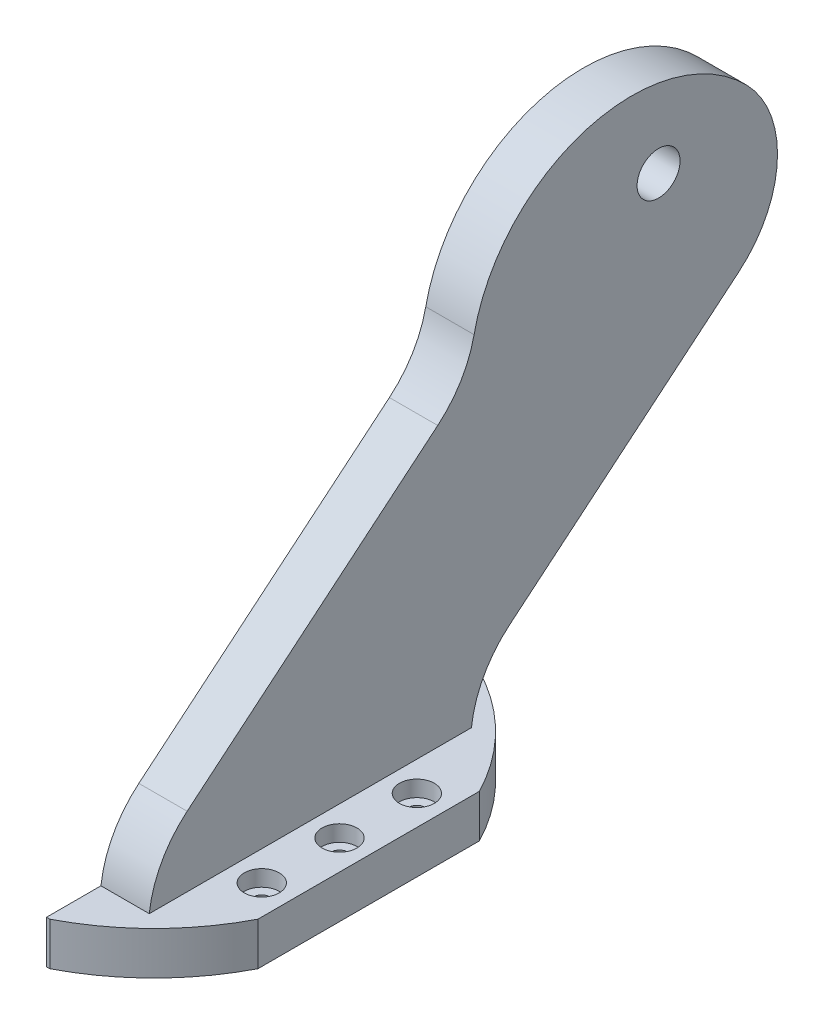
ISO-10303-21;
HEADER;
FILE_DESCRIPTION(('STEP AP214'),'2;1');
FILE_NAME('part.step','',(''),(''),'','','');
FILE_SCHEMA(('AUTOMOTIVE_DESIGN { 1 0 10303 214 1 1 1 1 }'));
ENDSEC;
DATA;
#1=APPLICATION_CONTEXT('core data for automotive mechanical design processes');
#2=APPLICATION_PROTOCOL_DEFINITION('international standard','automotive_design',2000,#1);
#3=PRODUCT_CONTEXT('',#1,'mechanical');
#4=PRODUCT('Part','Part','',(#3));
#5=PRODUCT_RELATED_PRODUCT_CATEGORY('part','',(#4));
#6=PRODUCT_DEFINITION_FORMATION('','',#4);
#7=PRODUCT_DEFINITION_CONTEXT('part definition',#1,'design');
#8=PRODUCT_DEFINITION('design','',#6,#7);
#9=PRODUCT_DEFINITION_SHAPE('','',#8);
#10=(LENGTH_UNIT() NAMED_UNIT(*) SI_UNIT(.MILLI.,.METRE.));
#11=(NAMED_UNIT(*) PLANE_ANGLE_UNIT() SI_UNIT($,.RADIAN.));
#12=(NAMED_UNIT(*) SI_UNIT($,.STERADIAN.) SOLID_ANGLE_UNIT());
#13=UNCERTAINTY_MEASURE_WITH_UNIT(LENGTH_MEASURE(1.E-05),#10,'distance_accuracy_value','');
#14=(GEOMETRIC_REPRESENTATION_CONTEXT(3) GLOBAL_UNCERTAINTY_ASSIGNED_CONTEXT((#13)) GLOBAL_UNIT_ASSIGNED_CONTEXT((#10,
#11,#12)) REPRESENTATION_CONTEXT('',''));
#15=CARTESIAN_POINT('',(0.,0.,0.));
#16=DIRECTION('',(0.,0.,1.));
#17=DIRECTION('',(1.,0.,0.));
#18=AXIS2_PLACEMENT_3D('',#15,#16,#17);
#19=CARTESIAN_POINT('',(14.5,-79.,14.4108650550875));
#20=DIRECTION('',(0.,1.,0.));
#21=DIRECTION('',(0.,0.,1.));
#22=AXIS2_PLACEMENT_3D('',#19,#20,#21);
#23=CYLINDRICAL_SURFACE('',#22,1.5);
#24=CARTESIAN_POINT('',(14.5,0.,14.4108650550875));
#25=DIRECTION('',(0.,-1.,0.));
#26=DIRECTION('',(0.,0.,-1.));
#27=AXIS2_PLACEMENT_3D('',#24,#25,#26);
#28=CIRCLE('',#27,1.5);
#29=CARTESIAN_POINT('',(14.5,0.,12.9108650550875));
#30=VERTEX_POINT('',#29);
#31=EDGE_CURVE('E211',#30,#30,#28,.T.);
#32=ORIENTED_EDGE('',*,*,#31,.T.);
#33=EDGE_LOOP('',(#32));
#34=FACE_BOUND('',#33,.T.);
#35=CARTESIAN_POINT('',(14.5,5.,14.4108650550875));
#36=DIRECTION('',(0.,1.,0.));
#37=DIRECTION('',(0.,0.,1.));
#38=AXIS2_PLACEMENT_3D('',#35,#36,#37);
#39=CIRCLE('',#38,1.5);
#40=CARTESIAN_POINT('',(14.5,5.,15.9108650550875));
#41=VERTEX_POINT('',#40);
#42=EDGE_CURVE('E40',#41,#41,#39,.F.);
#43=ORIENTED_EDGE('',*,*,#42,.F.);
#44=EDGE_LOOP('',(#43));
#45=FACE_BOUND('',#44,.T.);
#46=ADVANCED_FACE('F36',(#34,#45),#23,.F.);
#47=CARTESIAN_POINT('',(14.5,-79.,-0.0703103162123901));
#48=DIRECTION('',(0.,1.,0.));
#49=DIRECTION('',(0.,0.,1.));
#50=AXIS2_PLACEMENT_3D('',#47,#48,#49);
#51=CYLINDRICAL_SURFACE('',#50,1.5);
#52=CARTESIAN_POINT('',(14.5,0.,-0.0703103162123901));
#53=DIRECTION('',(0.,-1.,0.));
#54=DIRECTION('',(0.,0.,-1.));
#55=AXIS2_PLACEMENT_3D('',#52,#53,#54);
#56=CIRCLE('',#55,1.5);
#57=CARTESIAN_POINT('',(14.5,0.,-1.57031031621239));
#58=VERTEX_POINT('',#57);
#59=EDGE_CURVE('E214',#58,#58,#56,.T.);
#60=ORIENTED_EDGE('',*,*,#59,.T.);
#61=EDGE_LOOP('',(#60));
#62=FACE_BOUND('',#61,.T.);
#63=CARTESIAN_POINT('',(14.5,5.,-0.0703103162123901));
#64=DIRECTION('',(0.,1.,0.));
#65=DIRECTION('',(0.,0.,1.));
#66=AXIS2_PLACEMENT_3D('',#63,#64,#65);
#67=CIRCLE('',#66,1.5);
#68=CARTESIAN_POINT('',(14.5,5.,1.42968968378761));
#69=VERTEX_POINT('',#68);
#70=EDGE_CURVE('E221',#69,#69,#67,.F.);
#71=ORIENTED_EDGE('',*,*,#70,.F.);
#72=EDGE_LOOP('',(#71));
#73=FACE_BOUND('',#72,.T.);
#74=ADVANCED_FACE('F232',(#62,#73),#51,.F.);
#75=CARTESIAN_POINT('',(14.5,-79.,-14.4811753712999));
#76=DIRECTION('',(0.,1.,0.));
#77=DIRECTION('',(0.,0.,1.));
#78=AXIS2_PLACEMENT_3D('',#75,#76,#77);
#79=CYLINDRICAL_SURFACE('',#78,1.5);
#80=CARTESIAN_POINT('',(14.5,0.,-14.4811753712999));
#81=DIRECTION('',(0.,-1.,0.));
#82=DIRECTION('',(0.,0.,-1.));
#83=AXIS2_PLACEMENT_3D('',#80,#81,#82);
#84=CIRCLE('',#83,1.5);
#85=CARTESIAN_POINT('',(14.5,0.,-15.9811753712999));
#86=VERTEX_POINT('',#85);
#87=EDGE_CURVE('E147',#86,#86,#84,.T.);
#88=ORIENTED_EDGE('',*,*,#87,.T.);
#89=EDGE_LOOP('',(#88));
#90=FACE_BOUND('',#89,.T.);
#91=CARTESIAN_POINT('',(14.5,5.,-14.4811753712999));
#92=DIRECTION('',(0.,1.,0.));
#93=DIRECTION('',(0.,0.,1.));
#94=AXIS2_PLACEMENT_3D('',#91,#92,#93);
#95=CIRCLE('',#94,1.5);
#96=CARTESIAN_POINT('',(14.5,5.,-12.9811753712999));
#97=VERTEX_POINT('',#96);
#98=EDGE_CURVE('E219',#97,#97,#95,.F.);
#99=ORIENTED_EDGE('',*,*,#98,.F.);
#100=EDGE_LOOP('',(#99));
#101=FACE_BOUND('',#100,.T.);
#102=ADVANCED_FACE('F238',(#90,#101),#79,.F.);
#103=CARTESIAN_POINT('',(0.,8.,0.));
#104=DIRECTION('',(0.,-1.,0.));
#105=DIRECTION('',(0.,0.,-1.));
#106=AXIS2_PLACEMENT_3D('',#103,#104,#105);
#107=PLANE('',#106);
#108=CARTESIAN_POINT('',(14.5,8.,-14.4811753712999));
#109=DIRECTION('',(0.,1.,0.));
#110=DIRECTION('',(0.,0.,1.));
#111=AXIS2_PLACEMENT_3D('',#108,#109,#110);
#112=CIRCLE('',#111,3.25);
#113=CARTESIAN_POINT('',(14.5,8.,-11.2311753712999));
#114=VERTEX_POINT('',#113);
#115=EDGE_CURVE('E378',#114,#114,#112,.T.);
#116=ORIENTED_EDGE('',*,*,#115,.F.);
#117=EDGE_LOOP('',(#116));
#118=FACE_BOUND('',#117,.T.);
#119=CARTESIAN_POINT('',(14.5,8.,-0.0703103162123901));
#120=DIRECTION('',(0.,1.,0.));
#121=DIRECTION('',(0.,0.,1.));
#122=AXIS2_PLACEMENT_3D('',#119,#120,#121);
#123=CIRCLE('',#122,3.25);
#124=CARTESIAN_POINT('',(14.5,8.,3.17968968378761));
#125=VERTEX_POINT('',#124);
#126=EDGE_CURVE('E372',#125,#125,#123,.T.);
#127=ORIENTED_EDGE('',*,*,#126,.F.);
#128=EDGE_LOOP('',(#127));
#129=FACE_BOUND('',#128,.T.);
#130=CARTESIAN_POINT('',(14.5,8.,14.4108650550875));
#131=DIRECTION('',(0.,1.,0.));
#132=DIRECTION('',(0.,0.,1.));
#133=AXIS2_PLACEMENT_3D('',#130,#131,#132);
#134=CIRCLE('',#133,3.25);
#135=CARTESIAN_POINT('',(14.5,8.,17.6608650550875));
#136=VERTEX_POINT('',#135);
#137=EDGE_CURVE('E366',#136,#136,#134,.T.);
#138=ORIENTED_EDGE('',*,*,#137,.F.);
#139=EDGE_LOOP('',(#138));
#140=FACE_BOUND('',#139,.T.);
#141=DIRECTION('',(-1.,0.,0.));
#142=VECTOR('',#141,1.);
#143=CARTESIAN_POINT('',(13.,8.,-30.1406206324248));
#144=LINE('',#143,#142);
#145=CARTESIAN_POINT('',(9.00000000000001,8.00000000000001,-30.1406206324248));
#146=VERTEX_POINT('',#145);
#147=CARTESIAN_POINT('',(0.,8.,-30.1406206324248));
#148=VERTEX_POINT('',#147);
#149=EDGE_CURVE('E153',#146,#148,#144,.T.);
#150=ORIENTED_EDGE('',*,*,#149,.F.);
#151=DIRECTION('',(0.,0.,1.));
#152=VECTOR('',#151,1.);
#153=CARTESIAN_POINT('',(9.00000000000001,8.00000000000001,-87.1493241194241));
#154=LINE('',#153,#152);
#155=CARTESIAN_POINT('',(9.00000000000001,8.00000000000001,29.8593793675752));
#156=VERTEX_POINT('',#155);
#157=EDGE_CURVE('E137',#146,#156,#154,.T.);
#158=ORIENTED_EDGE('',*,*,#157,.T.);
#159=DIRECTION('',(-1.,0.,0.));
#160=VECTOR('',#159,1.);
#161=CARTESIAN_POINT('',(13.,8.,29.8593793675752));
#162=LINE('',#161,#160);
#163=CARTESIAN_POINT('',(0.,8.,29.8593793675752));
#164=VERTEX_POINT('',#163);
#165=EDGE_CURVE('E61',#164,#156,#162,.F.);
#166=ORIENTED_EDGE('',*,*,#165,.F.);
#167=DIRECTION('',(0.,0.,1.));
#168=VECTOR('',#167,1.);
#169=CARTESIAN_POINT('',(0.,8.,40.));
#170=LINE('',#169,#168);
#171=CARTESIAN_POINT('',(0.,8.,40.));
#172=VERTEX_POINT('',#171);
#173=EDGE_CURVE('E189',#164,#172,#170,.T.);
#174=ORIENTED_EDGE('',*,*,#173,.T.);
#175=DIRECTION('',(1.,0.,0.));
#176=VECTOR('',#175,1.);
#177=CARTESIAN_POINT('',(20.,8.,40.));
#178=LINE('',#177,#176);
#179=CARTESIAN_POINT('',(0.615528128088336,8.,40.));
#180=VERTEX_POINT('',#179);
#181=EDGE_CURVE('E188',#172,#180,#178,.T.);
#182=ORIENTED_EDGE('',*,*,#181,.T.);
#183=CARTESIAN_POINT('',(-20.,8.,0.));
#184=DIRECTION('',(0.,1.,0.));
#185=DIRECTION('',(0.,0.,1.));
#186=AXIS2_PLACEMENT_3D('',#183,#184,#185);
#187=CIRCLE('',#186,45.);
#188=CARTESIAN_POINT('',(20.,8.,20.6155281280883));
#189=VERTEX_POINT('',#188);
#190=EDGE_CURVE('E162',#180,#189,#187,.T.);
#191=ORIENTED_EDGE('',*,*,#190,.T.);
#192=DIRECTION('',(0.,0.,-1.));
#193=VECTOR('',#192,1.);
#194=CARTESIAN_POINT('',(20.,8.,-40.));
#195=LINE('',#194,#193);
#196=CARTESIAN_POINT('',(20.,8.,-20.6155281280883));
#197=VERTEX_POINT('',#196);
#198=EDGE_CURVE('E192',#189,#197,#195,.T.);
#199=ORIENTED_EDGE('',*,*,#198,.T.);
#200=CARTESIAN_POINT('',(-20.,8.,0.));
#201=DIRECTION('',(0.,1.,0.));
#202=DIRECTION('',(0.,0.,1.));
#203=AXIS2_PLACEMENT_3D('',#200,#201,#202);
#204=CIRCLE('',#203,45.);
#205=CARTESIAN_POINT('',(0.615528128088304,8.,-40.));
#206=VERTEX_POINT('',#205);
#207=EDGE_CURVE('E172',#197,#206,#204,.T.);
#208=ORIENTED_EDGE('',*,*,#207,.T.);
#209=DIRECTION('',(-1.,0.,0.));
#210=VECTOR('',#209,1.);
#211=CARTESIAN_POINT('',(0.,8.,-40.));
#212=LINE('',#211,#210);
#213=CARTESIAN_POINT('',(0.,8.,-40.));
#214=VERTEX_POINT('',#213);
#215=EDGE_CURVE('E195',#206,#214,#212,.T.);
#216=ORIENTED_EDGE('',*,*,#215,.T.);
#217=EDGE_CURVE('E160',#214,#148,#170,.T.);
#218=ORIENTED_EDGE('',*,*,#217,.T.);
#219=EDGE_LOOP('',(#150,#158,#166,#174,#182,#191,#199,#208,#216,#218));
#220=FACE_BOUND('',#219,.T.);
#221=ADVANCED_FACE('F158',(#118,#129,#140,#220),#107,.F.);
#222=CARTESIAN_POINT('',(20.,8.,40.));
#223=DIRECTION('',(0.,0.,-1.));
#224=DIRECTION('',(-1.,0.,0.));
#225=AXIS2_PLACEMENT_3D('',#222,#223,#224);
#226=PLANE('',#225);
#227=DIRECTION('',(0.,1.,0.));
#228=VECTOR('',#227,1.);
#229=CARTESIAN_POINT('',(0.615528128088336,0.,40.));
#230=LINE('',#229,#228);
#231=CARTESIAN_POINT('',(0.615528128088336,0.,40.));
#232=VERTEX_POINT('',#231);
#233=EDGE_CURVE('E181',#232,#180,#230,.T.);
#234=ORIENTED_EDGE('',*,*,#233,.T.);
#235=ORIENTED_EDGE('',*,*,#181,.F.);
#236=DIRECTION('',(0.,-1.,0.));
#237=VECTOR('',#236,1.);
#238=CARTESIAN_POINT('',(0.,8.,40.));
#239=LINE('',#238,#237);
#240=CARTESIAN_POINT('',(0.,0.,40.));
#241=VERTEX_POINT('',#240);
#242=EDGE_CURVE('E11',#172,#241,#239,.T.);
#243=ORIENTED_EDGE('',*,*,#242,.T.);
#244=DIRECTION('',(1.,0.,0.));
#245=VECTOR('',#244,1.);
#246=CARTESIAN_POINT('',(20.,0.,40.));
#247=LINE('',#246,#245);
#248=EDGE_CURVE('E178',#241,#232,#247,.T.);
#249=ORIENTED_EDGE('',*,*,#248,.T.);
#250=EDGE_LOOP('',(#234,#235,#243,#249));
#251=FACE_BOUND('',#250,.T.);
#252=ADVANCED_FACE('F38',(#251),#226,.F.);
#253=CARTESIAN_POINT('',(20.,8.,-40.));
#254=DIRECTION('',(-1.,0.,0.));
#255=DIRECTION('',(0.,0.,1.));
#256=AXIS2_PLACEMENT_3D('',#253,#254,#255);
#257=PLANE('',#256);
#258=DIRECTION('',(0.,1.,0.));
#259=VECTOR('',#258,1.);
#260=CARTESIAN_POINT('',(20.,0.,-20.6155281280883));
#261=LINE('',#260,#259);
#262=CARTESIAN_POINT('',(20.,0.,-20.6155281280883));
#263=VERTEX_POINT('',#262);
#264=EDGE_CURVE('E171',#263,#197,#261,.T.);
#265=ORIENTED_EDGE('',*,*,#264,.T.);
#266=ORIENTED_EDGE('',*,*,#198,.F.);
#267=DIRECTION('',(0.,1.,0.));
#268=VECTOR('',#267,1.);
#269=CARTESIAN_POINT('',(20.,0.,20.6155281280883));
#270=LINE('',#269,#268);
#271=CARTESIAN_POINT('',(20.,0.,20.6155281280883));
#272=VERTEX_POINT('',#271);
#273=EDGE_CURVE('E174',#272,#189,#270,.T.);
#274=ORIENTED_EDGE('',*,*,#273,.F.);
#275=DIRECTION('',(0.,0.,-1.));
#276=VECTOR('',#275,1.);
#277=CARTESIAN_POINT('',(20.,0.,-40.));
#278=LINE('',#277,#276);
#279=EDGE_CURVE('E199',#272,#263,#278,.T.);
#280=ORIENTED_EDGE('',*,*,#279,.T.);
#281=EDGE_LOOP('',(#265,#266,#274,#280));
#282=FACE_BOUND('',#281,.T.);
#283=ADVANCED_FACE('F298',(#282),#257,.F.);
#284=CARTESIAN_POINT('',(0.,8.,-40.));
#285=DIRECTION('',(0.,0.,1.));
#286=DIRECTION('',(1.,0.,0.));
#287=AXIS2_PLACEMENT_3D('',#284,#285,#286);
#288=PLANE('',#287);
#289=DIRECTION('',(0.,1.,0.));
#290=VECTOR('',#289,1.);
#291=CARTESIAN_POINT('',(0.615528128088304,0.,-40.));
#292=LINE('',#291,#290);
#293=CARTESIAN_POINT('',(0.615528128088304,0.,-40.));
#294=VERTEX_POINT('',#293);
#295=EDGE_CURVE('E175',#294,#206,#292,.T.);
#296=ORIENTED_EDGE('',*,*,#295,.F.);
#297=DIRECTION('',(-1.,0.,0.));
#298=VECTOR('',#297,1.);
#299=CARTESIAN_POINT('',(0.,0.,-40.));
#300=LINE('',#299,#298);
#301=CARTESIAN_POINT('',(0.,0.,-40.));
#302=VERTEX_POINT('',#301);
#303=EDGE_CURVE('E202',#294,#302,#300,.T.);
#304=ORIENTED_EDGE('',*,*,#303,.T.);
#305=DIRECTION('',(0.,-1.,0.));
#306=VECTOR('',#305,1.);
#307=CARTESIAN_POINT('',(0.,8.,-40.));
#308=LINE('',#307,#306);
#309=EDGE_CURVE('E45',#214,#302,#308,.T.);
#310=ORIENTED_EDGE('',*,*,#309,.F.);
#311=ORIENTED_EDGE('',*,*,#215,.F.);
#312=EDGE_LOOP('',(#296,#304,#310,#311));
#313=FACE_BOUND('',#312,.T.);
#314=ADVANCED_FACE('F292',(#313),#288,.F.);
#315=CARTESIAN_POINT('',(0.,0.,0.));
#316=DIRECTION('',(0.,-1.,0.));
#317=DIRECTION('',(0.,0.,-1.));
#318=AXIS2_PLACEMENT_3D('',#315,#316,#317);
#319=PLANE('',#318);
#320=ORIENTED_EDGE('',*,*,#87,.F.);
#321=EDGE_LOOP('',(#320));
#322=FACE_BOUND('',#321,.T.);
#323=ORIENTED_EDGE('',*,*,#59,.F.);
#324=EDGE_LOOP('',(#323));
#325=FACE_BOUND('',#324,.T.);
#326=ORIENTED_EDGE('',*,*,#31,.F.);
#327=EDGE_LOOP('',(#326));
#328=FACE_BOUND('',#327,.T.);
#329=ORIENTED_EDGE('',*,*,#248,.F.);
#330=DIRECTION('',(0.,0.,1.));
#331=VECTOR('',#330,1.);
#332=CARTESIAN_POINT('',(0.,0.,0.));
#333=LINE('',#332,#331);
#334=EDGE_CURVE('E204',#302,#241,#333,.T.);
#335=ORIENTED_EDGE('',*,*,#334,.F.);
#336=ORIENTED_EDGE('',*,*,#303,.F.);
#337=CARTESIAN_POINT('',(-20.,0.,0.));
#338=DIRECTION('',(0.,1.,0.));
#339=DIRECTION('',(0.,0.,1.));
#340=AXIS2_PLACEMENT_3D('',#337,#338,#339);
#341=CIRCLE('',#340,45.);
#342=EDGE_CURVE('E169',#263,#294,#341,.T.);
#343=ORIENTED_EDGE('',*,*,#342,.F.);
#344=ORIENTED_EDGE('',*,*,#279,.F.);
#345=CARTESIAN_POINT('',(-20.,0.,0.));
#346=DIRECTION('',(0.,1.,0.));
#347=DIRECTION('',(0.,0.,1.));
#348=AXIS2_PLACEMENT_3D('',#345,#346,#347);
#349=CIRCLE('',#348,45.);
#350=EDGE_CURVE('E164',#232,#272,#349,.T.);
#351=ORIENTED_EDGE('',*,*,#350,.F.);
#352=EDGE_LOOP('',(#329,#335,#336,#343,#344,#351));
#353=FACE_BOUND('',#352,.T.);
#354=ADVANCED_FACE('F289',(#322,#325,#328,#353),#319,.T.);
#355=CARTESIAN_POINT('',(0.,8.,0.));
#356=DIRECTION('',(1.,0.,0.));
#357=DIRECTION('',(0.,0.,-1.));
#358=AXIS2_PLACEMENT_3D('',#355,#356,#357);
#359=PLANE('',#358);
#360=ORIENTED_EDGE('',*,*,#334,.T.);
#361=ORIENTED_EDGE('',*,*,#242,.F.);
#362=ORIENTED_EDGE('',*,*,#173,.F.);
#363=CARTESIAN_POINT('',(0.,5.63250108031114,10.));
#364=DIRECTION('',(1.,0.,0.));
#365=DIRECTION('',(0.,0.,1.));
#366=AXIS2_PLACEMENT_3D('',#363,#364,#365);
#367=CIRCLE('',#366,20.);
#368=CARTESIAN_POINT('',(0.,20.9969266722587,22.8036879932895));
#369=VERTEX_POINT('',#368);
#370=EDGE_CURVE('E342',#369,#164,#367,.T.);
#371=ORIENTED_EDGE('',*,*,#370,.F.);
#372=DIRECTION('',(0.,-0.64018439966448,0.768221279597376));
#373=VECTOR('',#372,1.);
#374=CARTESIAN_POINT('',(0.,59.8885022104217,-23.8662026525061));
#375=LINE('',#374,#373);
#376=CARTESIAN_POINT('',(0.,59.8885022104217,-23.8662026525061));
#377=VERTEX_POINT('',#376);
#378=EDGE_CURVE('E339',#377,#369,#375,.T.);
#379=ORIENTED_EDGE('',*,*,#378,.F.);
#380=CARTESIAN_POINT('',(0.,75.2529278023692,-11.0625146592165));
#381=DIRECTION('',(-1.,0.,0.));
#382=DIRECTION('',(0.,0.,1.));
#383=AXIS2_PLACEMENT_3D('',#380,#381,#382);
#384=CIRCLE('',#383,20.);
#385=CARTESIAN_POINT('',(0.,71.1517566814215,-30.6375087955299));
#386=VERTEX_POINT('',#385);
#387=EDGE_CURVE('E336',#386,#377,#384,.T.);
#388=ORIENTED_EDGE('',*,*,#387,.F.);
#389=CARTESIAN_POINT('',(0.,65.,-60.));
#390=DIRECTION('',(1.,0.,0.));
#391=DIRECTION('',(0.,0.,-1.));
#392=AXIS2_PLACEMENT_3D('',#389,#390,#391);
#393=CIRCLE('',#392,30.);
#394=CARTESIAN_POINT('',(0.,85.9758070576268,-81.4479723582723));
#395=VERTEX_POINT('',#394);
#396=EDGE_CURVE('E333',#395,#386,#393,.T.);
#397=ORIENTED_EDGE('',*,*,#396,.F.);
#398=CARTESIAN_POINT('',(0.,71.9919356858756,-67.1493241194241));
#399=DIRECTION('',(1.,0.,0.));
#400=DIRECTION('',(0.,0.,1.));
#401=AXIS2_PLACEMENT_3D('',#398,#399,#400);
#402=CIRCLE('',#401,20.);
#403=CARTESIAN_POINT('',(0.,56.6275100939281,-79.9530121127137));
#404=VERTEX_POINT('',#403);
#405=EDGE_CURVE('E326',#404,#395,#402,.T.);
#406=ORIENTED_EDGE('',*,*,#405,.F.);
#407=DIRECTION('',(0.,0.64018439966448,-0.768221279597376));
#408=VECTOR('',#407,1.);
#409=CARTESIAN_POINT('',(0.,56.6275100939281,-79.9530121127137));
#410=LINE('',#409,#408);
#411=CARTESIAN_POINT('',(0.,20.9969266722587,-37.1963120067105));
#412=VERTEX_POINT('',#411);
#413=EDGE_CURVE('E324',#412,#404,#410,.T.);
#414=ORIENTED_EDGE('',*,*,#413,.F.);
#415=CARTESIAN_POINT('',(0.,5.63250108031115,-50.));
#416=DIRECTION('',(-1.,0.,0.));
#417=DIRECTION('',(0.,0.,1.));
#418=AXIS2_PLACEMENT_3D('',#415,#416,#417);
#419=CIRCLE('',#418,20.);
#420=EDGE_CURVE('E321',#148,#412,#419,.T.);
#421=ORIENTED_EDGE('',*,*,#420,.F.);
#422=ORIENTED_EDGE('',*,*,#217,.F.);
#423=ORIENTED_EDGE('',*,*,#309,.T.);
#424=EDGE_LOOP('',(#360,#361,#362,#371,#379,#388,#397,#406,#414,#421,#422,#423));
#425=FACE_BOUND('',#424,.T.);
#426=CARTESIAN_POINT('',(0.,80.,-65.));
#427=DIRECTION('',(1.,0.,0.));
#428=DIRECTION('',(0.,0.,-1.));
#429=AXIS2_PLACEMENT_3D('',#426,#427,#428);
#430=CIRCLE('',#429,4.00000000000001);
#431=CARTESIAN_POINT('',(0.,80.,-61.));
#432=VERTEX_POINT('',#431);
#433=EDGE_CURVE('E156',#432,#432,#430,.T.);
#434=ORIENTED_EDGE('',*,*,#433,.T.);
#435=EDGE_LOOP('',(#434));
#436=FACE_BOUND('',#435,.T.);
#437=ADVANCED_FACE('F284',(#425,#436),#359,.F.);
#438=CARTESIAN_POINT('',(-20.,0.,0.));
#439=DIRECTION('',(0.,1.,0.));
#440=DIRECTION('',(0.,0.,1.));
#441=AXIS2_PLACEMENT_3D('',#438,#439,#440);
#442=CYLINDRICAL_SURFACE('',#441,45.);
#443=ORIENTED_EDGE('',*,*,#190,.F.);
#444=ORIENTED_EDGE('',*,*,#233,.F.);
#445=ORIENTED_EDGE('',*,*,#350,.T.);
#446=ORIENTED_EDGE('',*,*,#273,.T.);
#447=EDGE_LOOP('',(#443,#444,#445,#446));
#448=FACE_BOUND('',#447,.T.);
#449=ADVANCED_FACE('F280',(#448),#442,.T.);
#450=CARTESIAN_POINT('',(-20.,0.,0.));
#451=DIRECTION('',(0.,1.,0.));
#452=DIRECTION('',(0.,0.,1.));
#453=AXIS2_PLACEMENT_3D('',#450,#451,#452);
#454=CYLINDRICAL_SURFACE('',#453,45.);
#455=ORIENTED_EDGE('',*,*,#207,.F.);
#456=ORIENTED_EDGE('',*,*,#264,.F.);
#457=ORIENTED_EDGE('',*,*,#342,.T.);
#458=ORIENTED_EDGE('',*,*,#295,.T.);
#459=EDGE_LOOP('',(#455,#456,#457,#458));
#460=FACE_BOUND('',#459,.T.);
#461=ADVANCED_FACE('F277',(#460),#454,.T.);
#462=CARTESIAN_POINT('',(13.,5.63250108031115,-50.));
#463=DIRECTION('',(-1.,0.,0.));
#464=DIRECTION('',(0.,0.,1.));
#465=AXIS2_PLACEMENT_3D('',#462,#463,#464);
#466=CYLINDRICAL_SURFACE('',#465,20.);
#467=DIRECTION('',(-1.,0.,0.));
#468=VECTOR('',#467,1.);
#469=CARTESIAN_POINT('',(13.,20.9969266722587,-37.1963120067105));
#470=LINE('',#469,#468);
#471=CARTESIAN_POINT('',(9.00000000000001,20.9969266722587,-37.1963120067105));
#472=VERTEX_POINT('',#471);
#473=EDGE_CURVE('E155',#472,#412,#470,.T.);
#474=ORIENTED_EDGE('',*,*,#473,.F.);
#475=CARTESIAN_POINT('',(9.00000000000001,5.63250108031115,-50.));
#476=DIRECTION('',(-1.,0.,0.));
#477=DIRECTION('',(0.,0.,1.));
#478=AXIS2_PLACEMENT_3D('',#475,#476,#477);
#479=CIRCLE('',#478,20.);
#480=EDGE_CURVE('E141',#472,#146,#479,.F.);
#481=ORIENTED_EDGE('',*,*,#480,.T.);
#482=ORIENTED_EDGE('',*,*,#149,.T.);
#483=ORIENTED_EDGE('',*,*,#420,.T.);
#484=EDGE_LOOP('',(#474,#481,#482,#483));
#485=FACE_BOUND('',#484,.T.);
#486=ADVANCED_FACE('F151',(#485),#466,.F.);
#487=CARTESIAN_POINT('',(13.,5.63250108031114,10.));
#488=DIRECTION('',(-1.,0.,0.));
#489=DIRECTION('',(0.,0.,1.));
#490=AXIS2_PLACEMENT_3D('',#487,#488,#489);
#491=CYLINDRICAL_SURFACE('',#490,20.);
#492=ORIENTED_EDGE('',*,*,#165,.T.);
#493=CARTESIAN_POINT('',(9.00000000000001,5.63250108031114,10.));
#494=DIRECTION('',(-1.,0.,0.));
#495=DIRECTION('',(0.,0.,1.));
#496=AXIS2_PLACEMENT_3D('',#493,#494,#495);
#497=CIRCLE('',#496,20.);
#498=CARTESIAN_POINT('',(9.00000000000001,20.9969266722587,22.8036879932895));
#499=VERTEX_POINT('',#498);
#500=EDGE_CURVE('E144',#156,#499,#497,.T.);
#501=ORIENTED_EDGE('',*,*,#500,.T.);
#502=DIRECTION('',(-1.,0.,0.));
#503=VECTOR('',#502,1.);
#504=CARTESIAN_POINT('',(13.,20.9969266722587,22.8036879932895));
#505=LINE('',#504,#503);
#506=EDGE_CURVE('E345',#499,#369,#505,.T.);
#507=ORIENTED_EDGE('',*,*,#506,.T.);
#508=ORIENTED_EDGE('',*,*,#370,.T.);
#509=EDGE_LOOP('',(#492,#501,#507,#508));
#510=FACE_BOUND('',#509,.T.);
#511=ADVANCED_FACE('F252',(#510),#491,.T.);
#512=CARTESIAN_POINT('',(13.,56.6275100939281,-79.9530121127137));
#513=DIRECTION('',(0.,0.768221279597376,0.64018439966448));
#514=DIRECTION('',(0.,-0.64018439966448,0.768221279597376));
#515=AXIS2_PLACEMENT_3D('',#512,#513,#514);
#516=PLANE('',#515);
#517=DIRECTION('',(-1.,0.,0.));
#518=VECTOR('',#517,1.);
#519=CARTESIAN_POINT('',(13.,56.6275100939281,-79.9530121127137));
#520=LINE('',#519,#518);
#521=CARTESIAN_POINT('',(9.00000000000001,56.6275100939281,-79.9530121127137));
#522=VERTEX_POINT('',#521);
#523=EDGE_CURVE('E353',#522,#404,#520,.T.);
#524=ORIENTED_EDGE('',*,*,#523,.F.);
#525=DIRECTION('',(0.,-0.64018439966448,0.768221279597376));
#526=VECTOR('',#525,1.);
#527=CARTESIAN_POINT('',(9.00000000000001,56.6275100939281,-79.9530121127137));
#528=LINE('',#527,#526);
#529=EDGE_CURVE('E355',#522,#472,#528,.T.);
#530=ORIENTED_EDGE('',*,*,#529,.T.);
#531=ORIENTED_EDGE('',*,*,#473,.T.);
#532=ORIENTED_EDGE('',*,*,#413,.T.);
#533=EDGE_LOOP('',(#524,#530,#531,#532));
#534=FACE_BOUND('',#533,.T.);
#535=ADVANCED_FACE('F255',(#534),#516,.F.);
#536=CARTESIAN_POINT('',(13.,71.9919356858756,-67.1493241194241));
#537=DIRECTION('',(-1.,0.,0.));
#538=DIRECTION('',(0.,0.,1.));
#539=AXIS2_PLACEMENT_3D('',#536,#537,#538);
#540=CYLINDRICAL_SURFACE('',#539,20.);
#541=CARTESIAN_POINT('',(9.00000000000001,71.9919356858756,-67.1493241194241));
#542=DIRECTION('',(-1.,0.,0.));
#543=DIRECTION('',(0.,0.,1.));
#544=AXIS2_PLACEMENT_3D('',#541,#542,#543);
#545=CIRCLE('',#544,20.);
#546=CARTESIAN_POINT('',(9.00000000000001,85.9758070576268,-81.4479723582723));
#547=VERTEX_POINT('',#546);
#548=EDGE_CURVE('E357',#547,#522,#545,.T.);
#549=ORIENTED_EDGE('',*,*,#548,.T.);
#550=ORIENTED_EDGE('',*,*,#523,.T.);
#551=ORIENTED_EDGE('',*,*,#405,.T.);
#552=DIRECTION('',(-1.,0.,0.));
#553=VECTOR('',#552,1.);
#554=CARTESIAN_POINT('',(13.,85.9758070576268,-81.4479723582723));
#555=LINE('',#554,#553);
#556=EDGE_CURVE('E351',#547,#395,#555,.T.);
#557=ORIENTED_EDGE('',*,*,#556,.F.);
#558=EDGE_LOOP('',(#549,#550,#551,#557));
#559=FACE_BOUND('',#558,.T.);
#560=ADVANCED_FACE('F267',(#559),#540,.T.);
#561=CARTESIAN_POINT('',(13.,65.,-60.));
#562=DIRECTION('',(-1.,0.,0.));
#563=DIRECTION('',(0.,0.,1.));
#564=AXIS2_PLACEMENT_3D('',#561,#562,#563);
#565=CYLINDRICAL_SURFACE('',#564,30.);
#566=CARTESIAN_POINT('',(9.00000000000001,65.,-60.));
#567=DIRECTION('',(-1.,0.,0.));
#568=DIRECTION('',(0.,0.,1.));
#569=AXIS2_PLACEMENT_3D('',#566,#567,#568);
#570=CIRCLE('',#569,30.);
#571=CARTESIAN_POINT('',(9.00000000000001,71.1517566814215,-30.6375087955299));
#572=VERTEX_POINT('',#571);
#573=EDGE_CURVE('E360',#572,#547,#570,.T.);
#574=ORIENTED_EDGE('',*,*,#573,.T.);
#575=ORIENTED_EDGE('',*,*,#556,.T.);
#576=ORIENTED_EDGE('',*,*,#396,.T.);
#577=DIRECTION('',(-1.,0.,0.));
#578=VECTOR('',#577,1.);
#579=CARTESIAN_POINT('',(13.,71.1517566814215,-30.6375087955299));
#580=LINE('',#579,#578);
#581=EDGE_CURVE('E349',#572,#386,#580,.T.);
#582=ORIENTED_EDGE('',*,*,#581,.F.);
#583=EDGE_LOOP('',(#574,#575,#576,#582));
#584=FACE_BOUND('',#583,.T.);
#585=ADVANCED_FACE('F263',(#584),#565,.T.);
#586=CARTESIAN_POINT('',(13.,75.2529278023692,-11.0625146592165));
#587=DIRECTION('',(-1.,0.,0.));
#588=DIRECTION('',(0.,0.,1.));
#589=AXIS2_PLACEMENT_3D('',#586,#587,#588);
#590=CYLINDRICAL_SURFACE('',#589,20.);
#591=DIRECTION('',(-1.,0.,0.));
#592=VECTOR('',#591,1.);
#593=CARTESIAN_POINT('',(13.,59.8885022104217,-23.8662026525061));
#594=LINE('',#593,#592);
#595=CARTESIAN_POINT('',(9.00000000000001,59.8885022104217,-23.8662026525061));
#596=VERTEX_POINT('',#595);
#597=EDGE_CURVE('E347',#596,#377,#594,.T.);
#598=ORIENTED_EDGE('',*,*,#597,.F.);
#599=CARTESIAN_POINT('',(9.00000000000001,75.2529278023692,-11.0625146592165));
#600=DIRECTION('',(-1.,0.,0.));
#601=DIRECTION('',(0.,0.,1.));
#602=AXIS2_PLACEMENT_3D('',#599,#600,#601);
#603=CIRCLE('',#602,20.);
#604=EDGE_CURVE('E53',#596,#572,#603,.F.);
#605=ORIENTED_EDGE('',*,*,#604,.T.);
#606=ORIENTED_EDGE('',*,*,#581,.T.);
#607=ORIENTED_EDGE('',*,*,#387,.T.);
#608=EDGE_LOOP('',(#598,#605,#606,#607));
#609=FACE_BOUND('',#608,.T.);
#610=ADVANCED_FACE('F259',(#609),#590,.F.);
#611=CARTESIAN_POINT('',(13.,59.8885022104217,-23.8662026525061));
#612=DIRECTION('',(0.,-0.768221279597376,-0.64018439966448));
#613=DIRECTION('',(0.,0.64018439966448,-0.768221279597376));
#614=AXIS2_PLACEMENT_3D('',#611,#612,#613);
#615=PLANE('',#614);
#616=ORIENTED_EDGE('',*,*,#506,.F.);
#617=DIRECTION('',(0.,0.64018439966448,-0.768221279597376));
#618=VECTOR('',#617,1.);
#619=CARTESIAN_POINT('',(9.00000000000001,59.8885022104217,-23.8662026525061));
#620=LINE('',#619,#618);
#621=EDGE_CURVE('E210',#499,#596,#620,.T.);
#622=ORIENTED_EDGE('',*,*,#621,.T.);
#623=ORIENTED_EDGE('',*,*,#597,.T.);
#624=ORIENTED_EDGE('',*,*,#378,.T.);
#625=EDGE_LOOP('',(#616,#622,#623,#624));
#626=FACE_BOUND('',#625,.T.);
#627=ADVANCED_FACE('F250',(#626),#615,.F.);
#628=CARTESIAN_POINT('',(13.,80.,-65.));
#629=DIRECTION('',(-1.,0.,0.));
#630=DIRECTION('',(0.,0.,1.));
#631=AXIS2_PLACEMENT_3D('',#628,#629,#630);
#632=CYLINDRICAL_SURFACE('',#631,4.00000000000001);
#633=CARTESIAN_POINT('',(9.00000000000001,80.,-65.));
#634=DIRECTION('',(-1.,0.,0.));
#635=DIRECTION('',(0.,0.,1.));
#636=AXIS2_PLACEMENT_3D('',#633,#634,#635);
#637=CIRCLE('',#636,4.00000000000001);
#638=CARTESIAN_POINT('',(9.00000000000001,80.,-61.));
#639=VERTEX_POINT('',#638);
#640=EDGE_CURVE('E146',#639,#639,#637,.T.);
#641=CARTESIAN_POINT('',(9.00000000000001,80.,-61.));
#642=CARTESIAN_POINT('',(8.90625000000001,80.,-61.));
#643=CARTESIAN_POINT('',(8.81250000000001,80.,-61.));
#644=CARTESIAN_POINT('',(8.62500000000001,80.,-61.));
#645=CARTESIAN_POINT('',(8.53125000000001,80.,-61.));
#646=CARTESIAN_POINT('',(8.34375000000001,80.,-61.));
#647=CARTESIAN_POINT('',(8.25000000000001,80.,-61.));
#648=CARTESIAN_POINT('',(8.06250000000001,80.,-61.));
#649=CARTESIAN_POINT('',(7.96875000000001,80.,-61.));
#650=CARTESIAN_POINT('',(7.78125000000001,80.,-61.));
#651=CARTESIAN_POINT('',(7.68750000000001,80.,-61.));
#652=CARTESIAN_POINT('',(7.50000000000001,80.,-61.));
#653=CARTESIAN_POINT('',(7.40625000000001,80.,-61.));
#654=CARTESIAN_POINT('',(7.21875000000001,80.,-61.));
#655=CARTESIAN_POINT('',(7.12500000000001,80.,-61.));
#656=CARTESIAN_POINT('',(6.93750000000001,80.,-61.));
#657=CARTESIAN_POINT('',(6.84375000000001,80.,-61.));
#658=CARTESIAN_POINT('',(6.65625000000001,80.,-61.));
#659=CARTESIAN_POINT('',(6.56250000000001,80.,-61.));
#660=CARTESIAN_POINT('',(6.37500000000001,80.,-61.));
#661=CARTESIAN_POINT('',(6.28125000000001,80.,-61.));
#662=CARTESIAN_POINT('',(6.09375000000001,80.,-61.));
#663=CARTESIAN_POINT('',(6.00000000000001,80.,-61.));
#664=CARTESIAN_POINT('',(5.81250000000001,80.,-61.));
#665=CARTESIAN_POINT('',(5.71875000000001,80.,-61.));
#666=CARTESIAN_POINT('',(5.53125000000001,80.,-61.));
#667=CARTESIAN_POINT('',(5.4375,80.,-61.));
#668=CARTESIAN_POINT('',(5.25,80.,-61.));
#669=CARTESIAN_POINT('',(5.15625,80.,-61.));
#670=CARTESIAN_POINT('',(4.96875,80.,-61.));
#671=CARTESIAN_POINT('',(4.875,80.,-61.));
#672=CARTESIAN_POINT('',(4.6875,80.,-61.));
#673=CARTESIAN_POINT('',(4.59375,80.,-61.));
#674=CARTESIAN_POINT('',(4.40625,80.,-61.));
#675=CARTESIAN_POINT('',(4.3125,80.,-61.));
#676=CARTESIAN_POINT('',(4.125,80.,-61.));
#677=CARTESIAN_POINT('',(4.03125,80.,-61.));
#678=CARTESIAN_POINT('',(3.84375,80.,-61.));
#679=CARTESIAN_POINT('',(3.75,80.,-61.));
#680=CARTESIAN_POINT('',(3.5625,80.,-61.));
#681=CARTESIAN_POINT('',(3.46875,80.,-61.));
#682=CARTESIAN_POINT('',(3.28125,80.,-61.));
#683=CARTESIAN_POINT('',(3.1875,80.,-61.));
#684=CARTESIAN_POINT('',(3.,80.,-61.));
#685=CARTESIAN_POINT('',(2.90625,80.,-61.));
#686=CARTESIAN_POINT('',(2.71875,80.,-61.));
#687=CARTESIAN_POINT('',(2.625,80.,-61.));
#688=CARTESIAN_POINT('',(2.4375,80.,-61.));
#689=CARTESIAN_POINT('',(2.34375,80.,-61.));
#690=CARTESIAN_POINT('',(2.15625,80.,-61.));
#691=CARTESIAN_POINT('',(2.0625,80.,-61.));
#692=CARTESIAN_POINT('',(1.875,80.,-61.));
#693=CARTESIAN_POINT('',(1.78125,80.,-61.));
#694=CARTESIAN_POINT('',(1.59375,80.,-61.));
#695=CARTESIAN_POINT('',(1.5,80.,-61.));
#696=CARTESIAN_POINT('',(1.3125,80.,-61.));
#697=CARTESIAN_POINT('',(1.21875,80.,-61.));
#698=CARTESIAN_POINT('',(1.03125,80.,-61.));
#699=CARTESIAN_POINT('',(0.937500000000001,80.,-61.));
#700=CARTESIAN_POINT('',(0.750000000000001,80.,-61.));
#701=CARTESIAN_POINT('',(0.656250000000001,80.,-61.));
#702=CARTESIAN_POINT('',(0.46875,80.,-61.));
#703=CARTESIAN_POINT('',(0.375,80.,-61.));
#704=CARTESIAN_POINT('',(0.1875,80.,-61.));
#705=CARTESIAN_POINT('',(0.0937500000000001,80.,-61.));
#706=CARTESIAN_POINT('',(0.,80.,-61.));
#707=B_SPLINE_CURVE_WITH_KNOTS('',3,(#641,#642,#643,#644,#645,#646,#647,#648,#649,#650,#651,
#652,#653,#654,#655,#656,#657,#658,#659,#660,#661,#662,#663,#664,#665,#666,#667,#668,#669,#670,
#671,#672,#673,#674,#675,#676,#677,#678,#679,#680,#681,#682,#683,#684,#685,#686,#687,#688,#689,
#690,#691,#692,#693,#694,#695,#696,#697,#698,#699,#700,#701,#702,#703,#704,#705,#706),
.UNSPECIFIED.,.F.,.F.,(4,2,2,2,2,2,2,2,2,2,2,2,2,2,2,2,2,2,2,2,2,2,2,2,2,2,2,2,2,2,2,2,4),(0.,
0.28125,0.5625,0.843750000000001,1.125,1.40625,1.6875,1.96875,2.25,2.53125,2.8125,3.09375,3.375,
3.65625,3.9375,4.21875,4.5,4.78125,5.0625,5.34375,5.62500000000001,5.90625000000001,
6.18750000000001,6.46875000000001,6.75000000000001,7.03125000000001,7.31250000000001,
7.59375000000001,7.87500000000001,8.15625000000001,8.43750000000001,8.71875000000001,
9.00000000000001),.UNSPECIFIED.);
#708=EDGE_CURVE('BSEAM246',#639,#432,#707,.T.);
#709=ORIENTED_EDGE('',*,*,#640,.F.);
#710=ORIENTED_EDGE('',*,*,#433,.F.);
#711=ORIENTED_EDGE('',*,*,#708,.T.);
#712=ORIENTED_EDGE('',*,*,#708,.F.);
#713=EDGE_LOOP('',(#709,#711,#710,#712));
#714=FACE_BOUND('',#713,.T.);
#715=ADVANCED_FACE('F246',(#714),#632,.F.);
#716=CARTESIAN_POINT('',(9.00000000000001,8.00000000000001,-87.1493241194241));
#717=DIRECTION('',(-1.,0.,0.));
#718=DIRECTION('',(0.,0.,1.));
#719=AXIS2_PLACEMENT_3D('',#716,#717,#718);
#720=PLANE('',#719);
#721=ORIENTED_EDGE('',*,*,#640,.T.);
#722=EDGE_LOOP('',(#721));
#723=FACE_BOUND('',#722,.T.);
#724=ORIENTED_EDGE('',*,*,#529,.F.);
#725=ORIENTED_EDGE('',*,*,#548,.F.);
#726=ORIENTED_EDGE('',*,*,#573,.F.);
#727=ORIENTED_EDGE('',*,*,#604,.F.);
#728=ORIENTED_EDGE('',*,*,#621,.F.);
#729=ORIENTED_EDGE('',*,*,#500,.F.);
#730=ORIENTED_EDGE('',*,*,#157,.F.);
#731=ORIENTED_EDGE('',*,*,#480,.F.);
#732=EDGE_LOOP('',(#724,#725,#726,#727,#728,#729,#730,#731));
#733=FACE_BOUND('',#732,.T.);
#734=ADVANCED_FACE('F140',(#723,#733),#720,.F.);
#735=CARTESIAN_POINT('',(14.5,5.,-14.4811753712999));
#736=DIRECTION('',(0.,1.,0.));
#737=DIRECTION('',(0.,0.,1.));
#738=AXIS2_PLACEMENT_3D('',#735,#736,#737);
#739=PLANE('',#738);
#740=CARTESIAN_POINT('',(14.5,5.,-14.4811753712999));
#741=DIRECTION('',(0.,1.,0.));
#742=DIRECTION('',(0.,0.,1.));
#743=AXIS2_PLACEMENT_3D('',#740,#741,#742);
#744=CIRCLE('',#743,3.25);
#745=CARTESIAN_POINT('',(14.5,5.,-11.2311753712999));
#746=VERTEX_POINT('',#745);
#747=EDGE_CURVE('E222',#746,#746,#744,.T.);
#748=ORIENTED_EDGE('',*,*,#747,.T.);
#749=EDGE_LOOP('',(#748));
#750=FACE_BOUND('',#749,.T.);
#751=ORIENTED_EDGE('',*,*,#98,.T.);
#752=EDGE_LOOP('',(#751));
#753=FACE_BOUND('',#752,.T.);
#754=ADVANCED_FACE('F245',(#750,#753),#739,.T.);
#755=CARTESIAN_POINT('',(14.5,5.,-14.4811753712999));
#756=DIRECTION('',(0.,1.,0.));
#757=DIRECTION('',(0.,0.,1.));
#758=AXIS2_PLACEMENT_3D('',#755,#756,#757);
#759=CYLINDRICAL_SURFACE('',#758,3.25);
#760=ORIENTED_EDGE('',*,*,#747,.F.);
#761=EDGE_LOOP('',(#760));
#762=FACE_BOUND('',#761,.T.);
#763=ORIENTED_EDGE('',*,*,#115,.T.);
#764=EDGE_LOOP('',(#763));
#765=FACE_BOUND('',#764,.T.);
#766=ADVANCED_FACE('F386',(#762,#765),#759,.F.);
#767=CARTESIAN_POINT('',(14.5,5.,-0.0703103162123901));
#768=DIRECTION('',(0.,1.,0.));
#769=DIRECTION('',(0.,0.,1.));
#770=AXIS2_PLACEMENT_3D('',#767,#768,#769);
#771=PLANE('',#770);
#772=CARTESIAN_POINT('',(14.5,5.,-0.0703103162123901));
#773=DIRECTION('',(0.,1.,0.));
#774=DIRECTION('',(0.,0.,1.));
#775=AXIS2_PLACEMENT_3D('',#772,#773,#774);
#776=CIRCLE('',#775,3.25);
#777=CARTESIAN_POINT('',(14.5,5.,3.17968968378761));
#778=VERTEX_POINT('',#777);
#779=EDGE_CURVE('E375',#778,#778,#776,.T.);
#780=ORIENTED_EDGE('',*,*,#779,.T.);
#781=EDGE_LOOP('',(#780));
#782=FACE_BOUND('',#781,.T.);
#783=ORIENTED_EDGE('',*,*,#70,.T.);
#784=EDGE_LOOP('',(#783));
#785=FACE_BOUND('',#784,.T.);
#786=ADVANCED_FACE('F389',(#782,#785),#771,.T.);
#787=CARTESIAN_POINT('',(14.5,5.,-0.0703103162123901));
#788=DIRECTION('',(0.,1.,0.));
#789=DIRECTION('',(0.,0.,1.));
#790=AXIS2_PLACEMENT_3D('',#787,#788,#789);
#791=CYLINDRICAL_SURFACE('',#790,3.25);
#792=ORIENTED_EDGE('',*,*,#779,.F.);
#793=EDGE_LOOP('',(#792));
#794=FACE_BOUND('',#793,.T.);
#795=ORIENTED_EDGE('',*,*,#126,.T.);
#796=EDGE_LOOP('',(#795));
#797=FACE_BOUND('',#796,.T.);
#798=ADVANCED_FACE('F404',(#794,#797),#791,.F.);
#799=CARTESIAN_POINT('',(14.5,5.,14.4108650550875));
#800=DIRECTION('',(0.,1.,0.));
#801=DIRECTION('',(0.,0.,1.));
#802=AXIS2_PLACEMENT_3D('',#799,#800,#801);
#803=PLANE('',#802);
#804=CARTESIAN_POINT('',(14.5,5.,14.4108650550875));
#805=DIRECTION('',(0.,1.,0.));
#806=DIRECTION('',(0.,0.,1.));
#807=AXIS2_PLACEMENT_3D('',#804,#805,#806);
#808=CIRCLE('',#807,3.25);
#809=CARTESIAN_POINT('',(14.5,5.,17.6608650550875));
#810=VERTEX_POINT('',#809);
#811=EDGE_CURVE('E369',#810,#810,#808,.T.);
#812=ORIENTED_EDGE('',*,*,#811,.T.);
#813=EDGE_LOOP('',(#812));
#814=FACE_BOUND('',#813,.T.);
#815=ORIENTED_EDGE('',*,*,#42,.T.);
#816=EDGE_LOOP('',(#815));
#817=FACE_BOUND('',#816,.T.);
#818=ADVANCED_FACE('F229',(#814,#817),#803,.T.);
#819=CARTESIAN_POINT('',(14.5,5.,14.4108650550875));
#820=DIRECTION('',(0.,1.,0.));
#821=DIRECTION('',(0.,0.,1.));
#822=AXIS2_PLACEMENT_3D('',#819,#820,#821);
#823=CYLINDRICAL_SURFACE('',#822,3.25);
#824=ORIENTED_EDGE('',*,*,#811,.F.);
#825=EDGE_LOOP('',(#824));
#826=FACE_BOUND('',#825,.T.);
#827=ORIENTED_EDGE('',*,*,#137,.T.);
#828=EDGE_LOOP('',(#827));
#829=FACE_BOUND('',#828,.T.);
#830=ADVANCED_FACE('F397',(#826,#829),#823,.F.);
#831=CLOSED_SHELL('',(#46,#74,#102,#221,#252,#283,#314,#354,#437,#449,#461,#486,#511,#535,#560,
#585,#610,#627,#715,#734,#754,#766,#786,#798,#818,#830));
#832=MANIFOLD_SOLID_BREP('B2',#831);
#833=ADVANCED_BREP_SHAPE_REPRESENTATION('',(#18,#832),#14);
#834=SHAPE_DEFINITION_REPRESENTATION(#9,#833);
ENDSEC;
END-ISO-10303-21;
